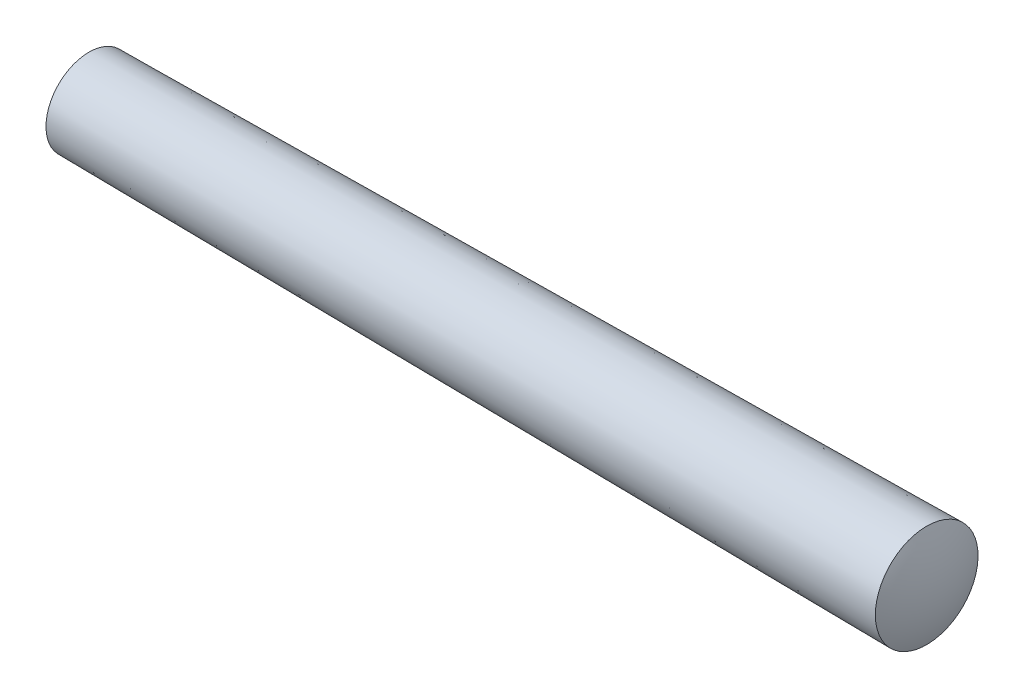
ISO-10303-21;
HEADER;
FILE_DESCRIPTION(('STEP AP214'),'2;1');
FILE_NAME('part.step','',(''),(''),'','','');
FILE_SCHEMA(('AUTOMOTIVE_DESIGN { 1 0 10303 214 1 1 1 1 }'));
ENDSEC;
DATA;
#1=APPLICATION_CONTEXT('core data for automotive mechanical design processes');
#2=APPLICATION_PROTOCOL_DEFINITION('international standard','automotive_design',2000,#1);
#3=PRODUCT_CONTEXT('',#1,'mechanical');
#4=PRODUCT('Part','Part','',(#3));
#5=PRODUCT_RELATED_PRODUCT_CATEGORY('part','',(#4));
#6=PRODUCT_DEFINITION_FORMATION('','',#4);
#7=PRODUCT_DEFINITION_CONTEXT('part definition',#1,'design');
#8=PRODUCT_DEFINITION('design','',#6,#7);
#9=PRODUCT_DEFINITION_SHAPE('','',#8);
#10=(LENGTH_UNIT() NAMED_UNIT(*) SI_UNIT(.MILLI.,.METRE.));
#11=(NAMED_UNIT(*) PLANE_ANGLE_UNIT() SI_UNIT($,.RADIAN.));
#12=(NAMED_UNIT(*) SI_UNIT($,.STERADIAN.) SOLID_ANGLE_UNIT());
#13=UNCERTAINTY_MEASURE_WITH_UNIT(LENGTH_MEASURE(1.E-05),#10,'distance_accuracy_value','');
#14=(GEOMETRIC_REPRESENTATION_CONTEXT(3) GLOBAL_UNCERTAINTY_ASSIGNED_CONTEXT((#13)) GLOBAL_UNIT_ASSIGNED_CONTEXT((#10,
#11,#12)) REPRESENTATION_CONTEXT('',''));
#15=CARTESIAN_POINT('',(0.,0.,0.));
#16=DIRECTION('',(0.,0.,1.));
#17=DIRECTION('',(1.,0.,0.));
#18=AXIS2_PLACEMENT_3D('',#15,#16,#17);
#19=CARTESIAN_POINT('',(42.6020168598998,0.,0.));
#20=DIRECTION('',(-1.,0.,0.));
#21=DIRECTION('',(0.,1.,0.));
#22=AXIS2_PLACEMENT_3D('',#19,#20,#21);
#23=SPHERICAL_SURFACE('',#22,7.39798314010016);
#24=CARTESIAN_POINT('',(49.37,0.,0.));
#25=DIRECTION('',(-1.,0.,0.));
#26=DIRECTION('',(0.,0.,1.));
#27=AXIS2_PLACEMENT_3D('',#24,#25,#26);
#28=CIRCLE('',#27,2.98739999941854);
#29=CARTESIAN_POINT('',(49.37,0.,2.98739999941854));
#30=VERTEX_POINT('',#29);
#31=EDGE_CURVE('E36',#30,#30,#28,.T.);
#32=ORIENTED_EDGE('',*,*,#31,.F.);
#33=EDGE_LOOP('',(#32));
#34=FACE_BOUND('',#33,.T.);
#35=ADVANCED_FACE('F30',(#34),#23,.T.);
#36=CARTESIAN_POINT('',(5.27531746031746,0.,0.));
#37=DIRECTION('',(-1.,0.,0.));
#38=DIRECTION('',(0.,1.,0.));
#39=AXIS2_PLACEMENT_3D('',#36,#37,#38);
#40=SPHERICAL_SURFACE('',#39,5.27531746031746);
#41=CARTESIAN_POINT('',(0.63,0.,0.));
#42=DIRECTION('',(-1.,0.,0.));
#43=DIRECTION('',(0.,0.,1.));
#44=AXIS2_PLACEMENT_3D('',#41,#42,#43);
#45=CIRCLE('',#44,2.5);
#46=CARTESIAN_POINT('',(0.63,0.,2.5));
#47=VERTEX_POINT('',#46);
#48=EDGE_CURVE('E10',#47,#47,#45,.T.);
#49=ORIENTED_EDGE('',*,*,#48,.T.);
#50=EDGE_LOOP('',(#49));
#51=FACE_BOUND('',#50,.T.);
#52=ADVANCED_FACE('F45',(#51),#40,.T.);
#53=CARTESIAN_POINT('',(49.37,0.,0.));
#54=DIRECTION('',(1.,0.,0.));
#55=DIRECTION('',(0.,0.,-1.));
#56=AXIS2_PLACEMENT_3D('',#53,#54,#55);
#57=CONICAL_SURFACE('',#56,2.98739999941854,0.00999966667473662);
#58=ORIENTED_EDGE('',*,*,#48,.F.);
#59=EDGE_LOOP('',(#58));
#60=FACE_BOUND('',#59,.T.);
#61=ORIENTED_EDGE('',*,*,#31,.T.);
#62=EDGE_LOOP('',(#61));
#63=FACE_BOUND('',#62,.T.);
#64=ADVANCED_FACE('F42',(#60,#63),#57,.T.);
#65=CLOSED_SHELL('',(#35,#52,#64));
#66=MANIFOLD_SOLID_BREP('B2',#65);
#67=ADVANCED_BREP_SHAPE_REPRESENTATION('',(#18,#66),#14);
#68=SHAPE_DEFINITION_REPRESENTATION(#9,#67);
ENDSEC;
END-ISO-10303-21;
